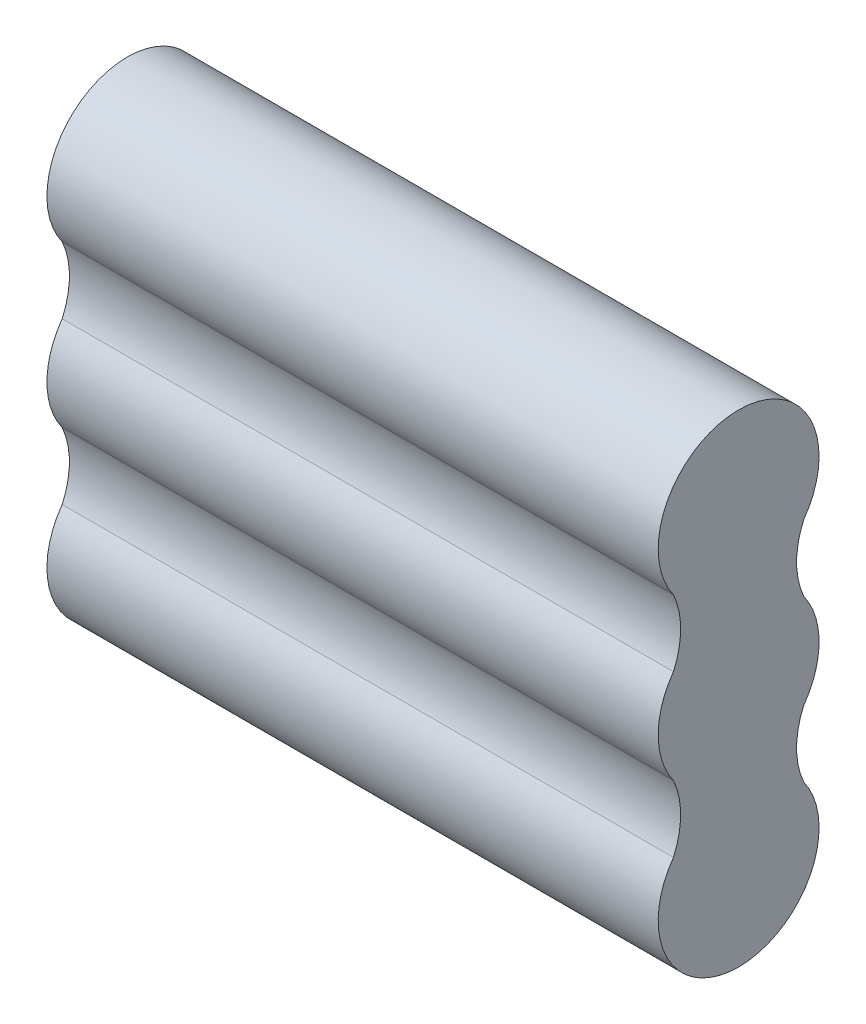
ISO-10303-21;
HEADER;
FILE_DESCRIPTION(('STEP AP214'),'2;1');
FILE_NAME('part.step','',(''),(''),'','','');
FILE_SCHEMA(('AUTOMOTIVE_DESIGN { 1 0 10303 214 1 1 1 1 }'));
ENDSEC;
DATA;
#1=APPLICATION_CONTEXT('core data for automotive mechanical design processes');
#2=APPLICATION_PROTOCOL_DEFINITION('international standard','automotive_design',2000,#1);
#3=PRODUCT_CONTEXT('',#1,'mechanical');
#4=PRODUCT('Part','Part','',(#3));
#5=PRODUCT_RELATED_PRODUCT_CATEGORY('part','',(#4));
#6=PRODUCT_DEFINITION_FORMATION('','',#4);
#7=PRODUCT_DEFINITION_CONTEXT('part definition',#1,'design');
#8=PRODUCT_DEFINITION('design','',#6,#7);
#9=PRODUCT_DEFINITION_SHAPE('','',#8);
#10=(LENGTH_UNIT() NAMED_UNIT(*) SI_UNIT(.MILLI.,.METRE.));
#11=(NAMED_UNIT(*) PLANE_ANGLE_UNIT() SI_UNIT($,.RADIAN.));
#12=(NAMED_UNIT(*) SI_UNIT($,.STERADIAN.) SOLID_ANGLE_UNIT());
#13=UNCERTAINTY_MEASURE_WITH_UNIT(LENGTH_MEASURE(1.E-05),#10,'distance_accuracy_value','');
#14=(GEOMETRIC_REPRESENTATION_CONTEXT(3) GLOBAL_UNCERTAINTY_ASSIGNED_CONTEXT((#13)) GLOBAL_UNIT_ASSIGNED_CONTEXT((#10,
#11,#12)) REPRESENTATION_CONTEXT('',''));
#15=CARTESIAN_POINT('',(0.,0.,0.));
#16=DIRECTION('',(0.,0.,1.));
#17=DIRECTION('',(1.,0.,0.));
#18=AXIS2_PLACEMENT_3D('',#15,#16,#17);
#19=CARTESIAN_POINT('',(-33.792,0.,8.89));
#20=DIRECTION('',(1.,0.,0.));
#21=DIRECTION('',(0.,0.,-1.));
#22=AXIS2_PLACEMENT_3D('',#19,#20,#21);
#23=CYLINDRICAL_SURFACE('',#22,8.89);
#24=DIRECTION('',(1.,0.,0.));
#25=VECTOR('',#24,1.);
#26=CARTESIAN_POINT('',(-33.792,-5.20797713402329,16.0947952206493));
#27=LINE('',#26,#25);
#28=CARTESIAN_POINT('',(-33.782,-5.20797713402329,16.0947952206493));
#29=VERTEX_POINT('',#28);
#30=CARTESIAN_POINT('',(33.782,-5.20797713402329,16.0947952206493));
#31=VERTEX_POINT('',#30);
#32=EDGE_CURVE('E119',#29,#31,#27,.T.);
#33=ORIENTED_EDGE('',*,*,#32,.T.);
#34=CARTESIAN_POINT('',(33.782,0.,8.89));
#35=DIRECTION('',(-1.,0.,0.));
#36=DIRECTION('',(0.,0.,1.));
#37=AXIS2_PLACEMENT_3D('',#34,#35,#36);
#38=CIRCLE('',#37,8.89);
#39=CARTESIAN_POINT('',(33.782,5.2079771340233,16.0947952206493));
#40=VERTEX_POINT('',#39);
#41=EDGE_CURVE('E108',#31,#40,#38,.T.);
#42=ORIENTED_EDGE('',*,*,#41,.T.);
#43=DIRECTION('',(1.,0.,0.));
#44=VECTOR('',#43,1.);
#45=CARTESIAN_POINT('',(-33.792,5.20797713402329,16.0947952206493));
#46=LINE('',#45,#44);
#47=CARTESIAN_POINT('',(-33.782,5.2079771340233,16.0947952206493));
#48=VERTEX_POINT('',#47);
#49=EDGE_CURVE('E117',#48,#40,#46,.T.);
#50=ORIENTED_EDGE('',*,*,#49,.F.);
#51=CARTESIAN_POINT('',(-33.782,0.,8.89));
#52=DIRECTION('',(1.,0.,0.));
#53=DIRECTION('',(0.,0.,-1.));
#54=AXIS2_PLACEMENT_3D('',#51,#52,#53);
#55=CIRCLE('',#54,8.89);
#56=EDGE_CURVE('E63',#48,#29,#55,.T.);
#57=ORIENTED_EDGE('',*,*,#56,.T.);
#58=EDGE_LOOP('',(#33,#42,#50,#57));
#59=FACE_BOUND('',#58,.T.);
#60=ADVANCED_FACE('F39',(#59),#23,.T.);
#61=CARTESIAN_POINT('',(-33.792,-17.78,8.89));
#62=DIRECTION('',(1.,0.,0.));
#63=DIRECTION('',(0.,0.,-1.));
#64=AXIS2_PLACEMENT_3D('',#61,#62,#63);
#65=CYLINDRICAL_SURFACE('',#64,8.89);
#66=CARTESIAN_POINT('',(-33.782,-17.78,8.89));
#67=DIRECTION('',(1.,0.,0.));
#68=DIRECTION('',(0.,0.,-1.));
#69=AXIS2_PLACEMENT_3D('',#66,#67,#68);
#70=CIRCLE('',#69,8.89);
#71=CARTESIAN_POINT('',(-33.782,-12.5720228659767,16.0947952206493));
#72=VERTEX_POINT('',#71);
#73=CARTESIAN_POINT('',(-33.782,-12.5720228659767,1.68520477935074));
#74=VERTEX_POINT('',#73);
#75=EDGE_CURVE('E139',#72,#74,#70,.T.);
#76=ORIENTED_EDGE('',*,*,#75,.T.);
#77=DIRECTION('',(1.,0.,0.));
#78=VECTOR('',#77,1.);
#79=CARTESIAN_POINT('',(-33.792,-12.5720228659767,1.68520477935074));
#80=LINE('',#79,#78);
#81=CARTESIAN_POINT('',(33.782,-12.5720228659767,1.68520477935074));
#82=VERTEX_POINT('',#81);
#83=EDGE_CURVE('E132',#74,#82,#80,.T.);
#84=ORIENTED_EDGE('',*,*,#83,.T.);
#85=CARTESIAN_POINT('',(33.782,-17.78,8.89));
#86=DIRECTION('',(-1.,0.,0.));
#87=DIRECTION('',(0.,0.,1.));
#88=AXIS2_PLACEMENT_3D('',#85,#86,#87);
#89=CIRCLE('',#88,8.89);
#90=CARTESIAN_POINT('',(33.782,-12.5720228659767,16.0947952206493));
#91=VERTEX_POINT('',#90);
#92=EDGE_CURVE('E126',#82,#91,#89,.T.);
#93=ORIENTED_EDGE('',*,*,#92,.T.);
#94=DIRECTION('',(1.,0.,0.));
#95=VECTOR('',#94,1.);
#96=CARTESIAN_POINT('',(-33.792,-12.5720228659767,16.0947952206493));
#97=LINE('',#96,#95);
#98=EDGE_CURVE('E122',#72,#91,#97,.T.);
#99=ORIENTED_EDGE('',*,*,#98,.F.);
#100=EDGE_LOOP('',(#76,#84,#93,#99));
#101=FACE_BOUND('',#100,.T.);
#102=ADVANCED_FACE('F179',(#101),#65,.T.);
#103=CARTESIAN_POINT('',(-33.792,-8.89,24.1864457083078));
#104=DIRECTION('',(1.,0.,0.));
#105=DIRECTION('',(0.,0.,-1.));
#106=AXIS2_PLACEMENT_3D('',#103,#104,#105);
#107=CYLINDRICAL_SURFACE('',#106,8.88999999999999);
#108=ORIENTED_EDGE('',*,*,#32,.F.);
#109=CARTESIAN_POINT('',(-33.782,-8.89,24.1864457083078));
#110=DIRECTION('',(1.,0.,0.));
#111=DIRECTION('',(0.,0.,-1.));
#112=AXIS2_PLACEMENT_3D('',#109,#110,#111);
#113=CIRCLE('',#112,8.88999999999999);
#114=EDGE_CURVE('E163',#29,#72,#113,.F.);
#115=ORIENTED_EDGE('',*,*,#114,.T.);
#116=ORIENTED_EDGE('',*,*,#98,.T.);
#117=CARTESIAN_POINT('',(33.782,-8.89,24.1864457083078));
#118=DIRECTION('',(-1.,0.,0.));
#119=DIRECTION('',(0.,0.,1.));
#120=AXIS2_PLACEMENT_3D('',#117,#118,#119);
#121=CIRCLE('',#120,8.88999999999999);
#122=EDGE_CURVE('E112',#91,#31,#121,.F.);
#123=ORIENTED_EDGE('',*,*,#122,.T.);
#124=EDGE_LOOP('',(#108,#115,#116,#123));
#125=FACE_BOUND('',#124,.T.);
#126=ADVANCED_FACE('F124',(#125),#107,.F.);
#127=CARTESIAN_POINT('',(-33.792,17.78,8.89));
#128=DIRECTION('',(1.,0.,0.));
#129=DIRECTION('',(0.,0.,-1.));
#130=AXIS2_PLACEMENT_3D('',#127,#128,#129);
#131=CYLINDRICAL_SURFACE('',#130,8.89);
#132=CARTESIAN_POINT('',(33.782,17.78,8.89));
#133=DIRECTION('',(-1.,0.,0.));
#134=DIRECTION('',(0.,0.,1.));
#135=AXIS2_PLACEMENT_3D('',#132,#133,#134);
#136=CIRCLE('',#135,8.89);
#137=CARTESIAN_POINT('',(33.782,12.5720228659767,16.0947952206493));
#138=VERTEX_POINT('',#137);
#139=CARTESIAN_POINT('',(33.782,12.5720228659767,1.68520477935074));
#140=VERTEX_POINT('',#139);
#141=EDGE_CURVE('E141',#138,#140,#136,.T.);
#142=ORIENTED_EDGE('',*,*,#141,.T.);
#143=DIRECTION('',(1.,0.,0.));
#144=VECTOR('',#143,1.);
#145=CARTESIAN_POINT('',(-33.792,12.5720228659767,1.68520477935074));
#146=LINE('',#145,#144);
#147=CARTESIAN_POINT('',(-33.782,12.5720228659767,1.68520477935074));
#148=VERTEX_POINT('',#147);
#149=EDGE_CURVE('E11',#148,#140,#146,.T.);
#150=ORIENTED_EDGE('',*,*,#149,.F.);
#151=CARTESIAN_POINT('',(-33.782,17.78,8.89));
#152=DIRECTION('',(1.,0.,0.));
#153=DIRECTION('',(0.,0.,-1.));
#154=AXIS2_PLACEMENT_3D('',#151,#152,#153);
#155=CIRCLE('',#154,8.89);
#156=CARTESIAN_POINT('',(-33.782,12.5720228659767,16.0947952206493));
#157=VERTEX_POINT('',#156);
#158=EDGE_CURVE('E55',#148,#157,#155,.T.);
#159=ORIENTED_EDGE('',*,*,#158,.T.);
#160=DIRECTION('',(1.,0.,0.));
#161=VECTOR('',#160,1.);
#162=CARTESIAN_POINT('',(-33.792,12.5720228659767,16.0947952206493));
#163=LINE('',#162,#161);
#164=EDGE_CURVE('E43',#157,#138,#163,.T.);
#165=ORIENTED_EDGE('',*,*,#164,.T.);
#166=EDGE_LOOP('',(#142,#150,#159,#165));
#167=FACE_BOUND('',#166,.T.);
#168=ADVANCED_FACE('F187',(#167),#131,.T.);
#169=CARTESIAN_POINT('',(-33.792,8.89,24.1864457083078));
#170=DIRECTION('',(1.,0.,0.));
#171=DIRECTION('',(0.,0.,-1.));
#172=AXIS2_PLACEMENT_3D('',#169,#170,#171);
#173=CYLINDRICAL_SURFACE('',#172,8.88999999999999);
#174=ORIENTED_EDGE('',*,*,#164,.F.);
#175=CARTESIAN_POINT('',(-33.782,8.89,24.1864457083078));
#176=DIRECTION('',(1.,0.,0.));
#177=DIRECTION('',(0.,0.,-1.));
#178=AXIS2_PLACEMENT_3D('',#175,#176,#177);
#179=CIRCLE('',#178,8.88999999999999);
#180=EDGE_CURVE('E135',#157,#48,#179,.F.);
#181=ORIENTED_EDGE('',*,*,#180,.T.);
#182=ORIENTED_EDGE('',*,*,#49,.T.);
#183=CARTESIAN_POINT('',(33.782,8.89,24.1864457083078));
#184=DIRECTION('',(-1.,0.,0.));
#185=DIRECTION('',(0.,0.,1.));
#186=AXIS2_PLACEMENT_3D('',#183,#184,#185);
#187=CIRCLE('',#186,8.88999999999999);
#188=EDGE_CURVE('E115',#40,#138,#187,.F.);
#189=ORIENTED_EDGE('',*,*,#188,.T.);
#190=EDGE_LOOP('',(#174,#181,#182,#189));
#191=FACE_BOUND('',#190,.T.);
#192=ADVANCED_FACE('F147',(#191),#173,.F.);
#193=CARTESIAN_POINT('',(-33.792,0.,8.89));
#194=DIRECTION('',(1.,0.,0.));
#195=DIRECTION('',(0.,0.,-1.));
#196=AXIS2_PLACEMENT_3D('',#193,#194,#195);
#197=CYLINDRICAL_SURFACE('',#196,8.89);
#198=DIRECTION('',(1.,0.,0.));
#199=VECTOR('',#198,1.);
#200=CARTESIAN_POINT('',(-33.792,-5.20797713402331,1.68520477935074));
#201=LINE('',#200,#199);
#202=CARTESIAN_POINT('',(-33.782,-5.20797713402331,1.68520477935074));
#203=VERTEX_POINT('',#202);
#204=CARTESIAN_POINT('',(33.782,-5.20797713402331,1.68520477935074));
#205=VERTEX_POINT('',#204);
#206=EDGE_CURVE('E164',#203,#205,#201,.T.);
#207=ORIENTED_EDGE('',*,*,#206,.F.);
#208=CARTESIAN_POINT('',(-33.782,0.,8.89));
#209=DIRECTION('',(1.,0.,0.));
#210=DIRECTION('',(0.,0.,-1.));
#211=AXIS2_PLACEMENT_3D('',#208,#209,#210);
#212=CIRCLE('',#211,8.89);
#213=CARTESIAN_POINT('',(-33.782,5.20797713402331,1.68520477935073));
#214=VERTEX_POINT('',#213);
#215=EDGE_CURVE('E158',#203,#214,#212,.T.);
#216=ORIENTED_EDGE('',*,*,#215,.T.);
#217=DIRECTION('',(1.,0.,0.));
#218=VECTOR('',#217,1.);
#219=CARTESIAN_POINT('',(-33.792,5.20797713402331,1.68520477935073));
#220=LINE('',#219,#218);
#221=CARTESIAN_POINT('',(33.782,5.20797713402331,1.68520477935073));
#222=VERTEX_POINT('',#221);
#223=EDGE_CURVE('E157',#214,#222,#220,.T.);
#224=ORIENTED_EDGE('',*,*,#223,.T.);
#225=CARTESIAN_POINT('',(33.782,0.,8.89));
#226=DIRECTION('',(-1.,0.,0.));
#227=DIRECTION('',(0.,0.,1.));
#228=AXIS2_PLACEMENT_3D('',#225,#226,#227);
#229=CIRCLE('',#228,8.89);
#230=EDGE_CURVE('E143',#222,#205,#229,.T.);
#231=ORIENTED_EDGE('',*,*,#230,.T.);
#232=EDGE_LOOP('',(#207,#216,#224,#231));
#233=FACE_BOUND('',#232,.T.);
#234=ADVANCED_FACE('F184',(#233),#197,.T.);
#235=CARTESIAN_POINT('',(-33.792,-8.89000000000002,-6.40644570830779));
#236=DIRECTION('',(1.,0.,0.));
#237=DIRECTION('',(0.,0.,-1.));
#238=AXIS2_PLACEMENT_3D('',#235,#236,#237);
#239=CYLINDRICAL_SURFACE('',#238,8.88999999999999);
#240=ORIENTED_EDGE('',*,*,#83,.F.);
#241=CARTESIAN_POINT('',(-33.782,-8.89000000000002,-6.40644570830779));
#242=DIRECTION('',(1.,0.,0.));
#243=DIRECTION('',(0.,0.,-1.));
#244=AXIS2_PLACEMENT_3D('',#241,#242,#243);
#245=CIRCLE('',#244,8.88999999999999);
#246=EDGE_CURVE('E140',#74,#203,#245,.F.);
#247=ORIENTED_EDGE('',*,*,#246,.T.);
#248=ORIENTED_EDGE('',*,*,#206,.T.);
#249=CARTESIAN_POINT('',(33.782,-8.89000000000002,-6.40644570830779));
#250=DIRECTION('',(-1.,0.,0.));
#251=DIRECTION('',(0.,0.,1.));
#252=AXIS2_PLACEMENT_3D('',#249,#250,#251);
#253=CIRCLE('',#252,8.88999999999999);
#254=EDGE_CURVE('E145',#205,#82,#253,.F.);
#255=ORIENTED_EDGE('',*,*,#254,.T.);
#256=EDGE_LOOP('',(#240,#247,#248,#255));
#257=FACE_BOUND('',#256,.T.);
#258=ADVANCED_FACE('F181',(#257),#239,.F.);
#259=CARTESIAN_POINT('',(-33.792,8.89000000000002,-6.4064457083078));
#260=DIRECTION('',(1.,0.,0.));
#261=DIRECTION('',(0.,0.,-1.));
#262=AXIS2_PLACEMENT_3D('',#259,#260,#261);
#263=CYLINDRICAL_SURFACE('',#262,8.88999999999999);
#264=ORIENTED_EDGE('',*,*,#223,.F.);
#265=CARTESIAN_POINT('',(-33.782,8.89000000000002,-6.4064457083078));
#266=DIRECTION('',(1.,0.,0.));
#267=DIRECTION('',(0.,0.,-1.));
#268=AXIS2_PLACEMENT_3D('',#265,#266,#267);
#269=CIRCLE('',#268,8.88999999999999);
#270=EDGE_CURVE('E134',#214,#148,#269,.F.);
#271=ORIENTED_EDGE('',*,*,#270,.T.);
#272=ORIENTED_EDGE('',*,*,#149,.T.);
#273=CARTESIAN_POINT('',(33.782,8.89000000000002,-6.4064457083078));
#274=DIRECTION('',(-1.,0.,0.));
#275=DIRECTION('',(0.,0.,1.));
#276=AXIS2_PLACEMENT_3D('',#273,#274,#275);
#277=CIRCLE('',#276,8.88999999999999);
#278=EDGE_CURVE('E144',#140,#222,#277,.F.);
#279=ORIENTED_EDGE('',*,*,#278,.T.);
#280=EDGE_LOOP('',(#264,#271,#272,#279));
#281=FACE_BOUND('',#280,.T.);
#282=ADVANCED_FACE('F153',(#281),#263,.F.);
#283=CARTESIAN_POINT('',(-33.782,27.94,17.78));
#284=DIRECTION('',(1.,0.,0.));
#285=DIRECTION('',(0.,0.,-1.));
#286=AXIS2_PLACEMENT_3D('',#283,#284,#285);
#287=PLANE('',#286);
#288=ORIENTED_EDGE('',*,*,#114,.F.);
#289=ORIENTED_EDGE('',*,*,#56,.F.);
#290=ORIENTED_EDGE('',*,*,#180,.F.);
#291=ORIENTED_EDGE('',*,*,#158,.F.);
#292=ORIENTED_EDGE('',*,*,#270,.F.);
#293=ORIENTED_EDGE('',*,*,#215,.F.);
#294=ORIENTED_EDGE('',*,*,#246,.F.);
#295=ORIENTED_EDGE('',*,*,#75,.F.);
#296=EDGE_LOOP('',(#288,#289,#290,#291,#292,#293,#294,#295));
#297=FACE_BOUND('',#296,.T.);
#298=ADVANCED_FACE('F41',(#297),#287,.F.);
#299=CARTESIAN_POINT('',(33.782,27.94,17.78));
#300=DIRECTION('',(-1.,0.,0.));
#301=DIRECTION('',(0.,0.,1.));
#302=AXIS2_PLACEMENT_3D('',#299,#300,#301);
#303=PLANE('',#302);
#304=ORIENTED_EDGE('',*,*,#41,.F.);
#305=ORIENTED_EDGE('',*,*,#122,.F.);
#306=ORIENTED_EDGE('',*,*,#92,.F.);
#307=ORIENTED_EDGE('',*,*,#254,.F.);
#308=ORIENTED_EDGE('',*,*,#230,.F.);
#309=ORIENTED_EDGE('',*,*,#278,.F.);
#310=ORIENTED_EDGE('',*,*,#141,.F.);
#311=ORIENTED_EDGE('',*,*,#188,.F.);
#312=EDGE_LOOP('',(#304,#305,#306,#307,#308,#309,#310,#311));
#313=FACE_BOUND('',#312,.T.);
#314=ADVANCED_FACE('F110',(#313),#303,.F.);
#315=CLOSED_SHELL('',(#60,#102,#126,#168,#192,#234,#258,#282,#298,#314));
#316=MANIFOLD_SOLID_BREP('B2',#315);
#317=ADVANCED_BREP_SHAPE_REPRESENTATION('',(#18,#316),#14);
#318=SHAPE_DEFINITION_REPRESENTATION(#9,#317);
ENDSEC;
END-ISO-10303-21;
